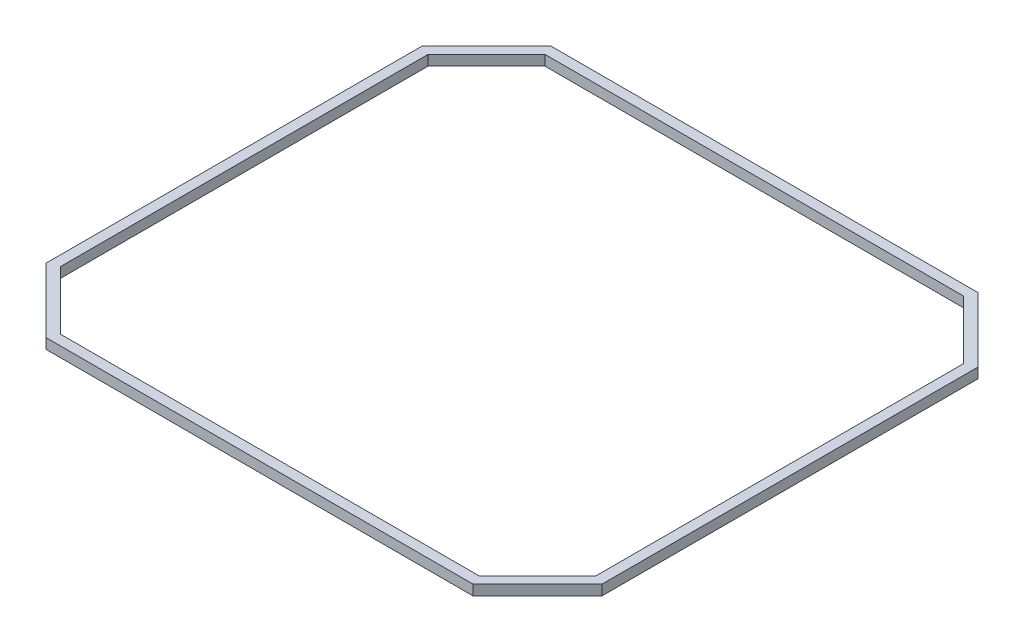
ISO-10303-21;
HEADER;
FILE_DESCRIPTION(('STEP AP214'),'2;1');
FILE_NAME('part.step','',(''),(''),'','','');
FILE_SCHEMA(('AUTOMOTIVE_DESIGN { 1 0 10303 214 1 1 1 1 }'));
ENDSEC;
DATA;
#1=APPLICATION_CONTEXT('core data for automotive mechanical design processes');
#2=APPLICATION_PROTOCOL_DEFINITION('international standard','automotive_design',2000,#1);
#3=PRODUCT_CONTEXT('',#1,'mechanical');
#4=PRODUCT('Part','Part','',(#3));
#5=PRODUCT_RELATED_PRODUCT_CATEGORY('part','',(#4));
#6=PRODUCT_DEFINITION_FORMATION('','',#4);
#7=PRODUCT_DEFINITION_CONTEXT('part definition',#1,'design');
#8=PRODUCT_DEFINITION('design','',#6,#7);
#9=PRODUCT_DEFINITION_SHAPE('','',#8);
#10=(LENGTH_UNIT() NAMED_UNIT(*) SI_UNIT(.MILLI.,.METRE.));
#11=(NAMED_UNIT(*) PLANE_ANGLE_UNIT() SI_UNIT($,.RADIAN.));
#12=(NAMED_UNIT(*) SI_UNIT($,.STERADIAN.) SOLID_ANGLE_UNIT());
#13=UNCERTAINTY_MEASURE_WITH_UNIT(LENGTH_MEASURE(1.E-05),#10,'distance_accuracy_value','');
#14=(GEOMETRIC_REPRESENTATION_CONTEXT(3) GLOBAL_UNCERTAINTY_ASSIGNED_CONTEXT((#13)) GLOBAL_UNIT_ASSIGNED_CONTEXT((#10,
#11,#12)) REPRESENTATION_CONTEXT('',''));
#15=CARTESIAN_POINT('',(0.,0.,0.));
#16=DIRECTION('',(0.,0.,1.));
#17=DIRECTION('',(1.,0.,0.));
#18=AXIS2_PLACEMENT_3D('',#15,#16,#17);
#19=CARTESIAN_POINT('',(0.,2.,0.));
#20=DIRECTION('',(0.,1.,0.));
#21=DIRECTION('',(0.,0.,1.));
#22=AXIS2_PLACEMENT_3D('',#19,#20,#21);
#23=PLANE('',#22);
#24=DIRECTION('',(-1.,0.,0.));
#25=VECTOR('',#24,1.);
#26=CARTESIAN_POINT('',(41.8639610306789,2.,-49.5));
#27=LINE('',#26,#25);
#28=CARTESIAN_POINT('',(41.8639610306789,2.,-49.5));
#29=VERTEX_POINT('',#28);
#30=CARTESIAN_POINT('',(-41.8639610306789,2.,-49.5));
#31=VERTEX_POINT('',#30);
#32=EDGE_CURVE('E211',#29,#31,#27,.T.);
#33=ORIENTED_EDGE('',*,*,#32,.T.);
#34=DIRECTION('',(-0.707106781186547,0.,0.707106781186547));
#35=VECTOR('',#34,1.);
#36=CARTESIAN_POINT('',(-41.8639610306789,2.,-49.5));
#37=LINE('',#36,#35);
#38=CARTESIAN_POINT('',(-54.5,2.,-36.8639610306789));
#39=VERTEX_POINT('',#38);
#40=EDGE_CURVE('E214',#31,#39,#37,.T.);
#41=ORIENTED_EDGE('',*,*,#40,.T.);
#42=DIRECTION('',(0.,0.,1.));
#43=VECTOR('',#42,1.);
#44=CARTESIAN_POINT('',(-54.5,2.,-36.8639610306789));
#45=LINE('',#44,#43);
#46=CARTESIAN_POINT('',(-54.5,2.,36.8639610306789));
#47=VERTEX_POINT('',#46);
#48=EDGE_CURVE('E217',#39,#47,#45,.T.);
#49=ORIENTED_EDGE('',*,*,#48,.T.);
#50=DIRECTION('',(0.707106781186547,0.,0.707106781186547));
#51=VECTOR('',#50,1.);
#52=CARTESIAN_POINT('',(-54.5,2.,36.8639610306789));
#53=LINE('',#52,#51);
#54=CARTESIAN_POINT('',(-41.8639610306789,2.,49.5));
#55=VERTEX_POINT('',#54);
#56=EDGE_CURVE('E219',#47,#55,#53,.T.);
#57=ORIENTED_EDGE('',*,*,#56,.T.);
#58=DIRECTION('',(1.,0.,0.));
#59=VECTOR('',#58,1.);
#60=CARTESIAN_POINT('',(-41.8639610306789,2.,49.5));
#61=LINE('',#60,#59);
#62=CARTESIAN_POINT('',(41.8639610306789,2.,49.5));
#63=VERTEX_POINT('',#62);
#64=EDGE_CURVE('E221',#55,#63,#61,.T.);
#65=ORIENTED_EDGE('',*,*,#64,.T.);
#66=DIRECTION('',(0.707106781186547,0.,-0.707106781186547));
#67=VECTOR('',#66,1.);
#68=CARTESIAN_POINT('',(41.8639610306789,2.,49.5));
#69=LINE('',#68,#67);
#70=CARTESIAN_POINT('',(54.5,2.,36.8639610306789));
#71=VERTEX_POINT('',#70);
#72=EDGE_CURVE('E223',#63,#71,#69,.T.);
#73=ORIENTED_EDGE('',*,*,#72,.T.);
#74=DIRECTION('',(0.,0.,-1.));
#75=VECTOR('',#74,1.);
#76=CARTESIAN_POINT('',(54.5,2.,36.8639610306789));
#77=LINE('',#76,#75);
#78=CARTESIAN_POINT('',(54.5,2.,-36.8639610306789));
#79=VERTEX_POINT('',#78);
#80=EDGE_CURVE('E225',#71,#79,#77,.T.);
#81=ORIENTED_EDGE('',*,*,#80,.T.);
#82=DIRECTION('',(-0.707106781186547,0.,-0.707106781186547));
#83=VECTOR('',#82,1.);
#84=CARTESIAN_POINT('',(54.5,2.,-36.8639610306789));
#85=LINE('',#84,#83);
#86=EDGE_CURVE('E227',#79,#29,#85,.T.);
#87=ORIENTED_EDGE('',*,*,#86,.T.);
#88=EDGE_LOOP('',(#33,#41,#49,#57,#65,#73,#81,#87));
#89=FACE_BOUND('',#88,.T.);
#90=DIRECTION('',(-0.707106781186548,0.,0.707106781186548));
#91=VECTOR('',#90,1.);
#92=CARTESIAN_POINT('',(-41.0355339059327,2.,-47.5));
#93=LINE('',#92,#91);
#94=CARTESIAN_POINT('',(-41.0355339059327,2.,-47.5));
#95=VERTEX_POINT('',#94);
#96=CARTESIAN_POINT('',(-52.5,2.,-36.0355339059327));
#97=VERTEX_POINT('',#96);
#98=EDGE_CURVE('E154',#95,#97,#93,.T.);
#99=ORIENTED_EDGE('',*,*,#98,.F.);
#100=DIRECTION('',(-1.,0.,0.));
#101=VECTOR('',#100,1.);
#102=CARTESIAN_POINT('',(41.0355339059327,2.,-47.5));
#103=LINE('',#102,#101);
#104=CARTESIAN_POINT('',(41.0355339059327,2.,-47.5));
#105=VERTEX_POINT('',#104);
#106=EDGE_CURVE('E146',#105,#95,#103,.T.);
#107=ORIENTED_EDGE('',*,*,#106,.F.);
#108=DIRECTION('',(-0.707106781186548,0.,-0.707106781186548));
#109=VECTOR('',#108,1.);
#110=CARTESIAN_POINT('',(52.5,2.,-36.0355339059327));
#111=LINE('',#110,#109);
#112=CARTESIAN_POINT('',(52.5,2.,-36.0355339059327));
#113=VERTEX_POINT('',#112);
#114=EDGE_CURVE('E179',#113,#105,#111,.T.);
#115=ORIENTED_EDGE('',*,*,#114,.F.);
#116=DIRECTION('',(0.,0.,-1.));
#117=VECTOR('',#116,1.);
#118=CARTESIAN_POINT('',(52.5,2.,36.0355339059327));
#119=LINE('',#118,#117);
#120=CARTESIAN_POINT('',(52.5,2.,36.0355339059327));
#121=VERTEX_POINT('',#120);
#122=EDGE_CURVE('E177',#121,#113,#119,.T.);
#123=ORIENTED_EDGE('',*,*,#122,.F.);
#124=DIRECTION('',(0.707106781186548,0.,-0.707106781186548));
#125=VECTOR('',#124,1.);
#126=CARTESIAN_POINT('',(41.0355339059327,2.,47.5));
#127=LINE('',#126,#125);
#128=CARTESIAN_POINT('',(41.0355339059327,2.,47.5));
#129=VERTEX_POINT('',#128);
#130=EDGE_CURVE('E175',#129,#121,#127,.T.);
#131=ORIENTED_EDGE('',*,*,#130,.F.);
#132=DIRECTION('',(1.,0.,0.));
#133=VECTOR('',#132,1.);
#134=CARTESIAN_POINT('',(-41.0355339059327,2.,47.5));
#135=LINE('',#134,#133);
#136=CARTESIAN_POINT('',(-41.0355339059327,2.,47.5));
#137=VERTEX_POINT('',#136);
#138=EDGE_CURVE('E173',#137,#129,#135,.T.);
#139=ORIENTED_EDGE('',*,*,#138,.F.);
#140=DIRECTION('',(0.707106781186548,0.,0.707106781186548));
#141=VECTOR('',#140,1.);
#142=CARTESIAN_POINT('',(-52.5,2.,36.0355339059327));
#143=LINE('',#142,#141);
#144=CARTESIAN_POINT('',(-52.5,2.,36.0355339059327));
#145=VERTEX_POINT('',#144);
#146=EDGE_CURVE('E169',#145,#137,#143,.T.);
#147=ORIENTED_EDGE('',*,*,#146,.F.);
#148=DIRECTION('',(0.,0.,1.));
#149=VECTOR('',#148,1.);
#150=CARTESIAN_POINT('',(-52.5,2.,-36.0355339059327));
#151=LINE('',#150,#149);
#152=EDGE_CURVE('E167',#97,#145,#151,.T.);
#153=ORIENTED_EDGE('',*,*,#152,.F.);
#154=EDGE_LOOP('',(#99,#107,#115,#123,#131,#139,#147,#153));
#155=FACE_BOUND('',#154,.T.);
#156=ADVANCED_FACE('F33',(#89,#155),#23,.T.);
#157=CARTESIAN_POINT('',(0.,0.,0.));
#158=DIRECTION('',(0.,1.,0.));
#159=DIRECTION('',(0.,0.,1.));
#160=AXIS2_PLACEMENT_3D('',#157,#158,#159);
#161=PLANE('',#160);
#162=DIRECTION('',(-1.,0.,0.));
#163=VECTOR('',#162,1.);
#164=CARTESIAN_POINT('',(41.8639610306789,0.,-49.5));
#165=LINE('',#164,#163);
#166=CARTESIAN_POINT('',(41.8639610306789,0.,-49.5));
#167=VERTEX_POINT('',#166);
#168=CARTESIAN_POINT('',(-41.8639610306789,0.,-49.5));
#169=VERTEX_POINT('',#168);
#170=EDGE_CURVE('E162',#167,#169,#165,.T.);
#171=ORIENTED_EDGE('',*,*,#170,.F.);
#172=DIRECTION('',(-0.707106781186547,0.,-0.707106781186547));
#173=VECTOR('',#172,1.);
#174=CARTESIAN_POINT('',(54.5,0.,-36.8639610306789));
#175=LINE('',#174,#173);
#176=CARTESIAN_POINT('',(54.5,0.,-36.8639610306789));
#177=VERTEX_POINT('',#176);
#178=EDGE_CURVE('E215',#177,#167,#175,.T.);
#179=ORIENTED_EDGE('',*,*,#178,.F.);
#180=DIRECTION('',(0.,0.,-1.));
#181=VECTOR('',#180,1.);
#182=CARTESIAN_POINT('',(54.5,0.,36.8639610306789));
#183=LINE('',#182,#181);
#184=CARTESIAN_POINT('',(54.5,0.,36.8639610306789));
#185=VERTEX_POINT('',#184);
#186=EDGE_CURVE('E242',#185,#177,#183,.T.);
#187=ORIENTED_EDGE('',*,*,#186,.F.);
#188=DIRECTION('',(0.707106781186547,0.,-0.707106781186547));
#189=VECTOR('',#188,1.);
#190=CARTESIAN_POINT('',(41.8639610306789,0.,49.5));
#191=LINE('',#190,#189);
#192=CARTESIAN_POINT('',(41.8639610306789,0.,49.5));
#193=VERTEX_POINT('',#192);
#194=EDGE_CURVE('E240',#193,#185,#191,.T.);
#195=ORIENTED_EDGE('',*,*,#194,.F.);
#196=DIRECTION('',(1.,0.,0.));
#197=VECTOR('',#196,1.);
#198=CARTESIAN_POINT('',(-41.8639610306789,0.,49.5));
#199=LINE('',#198,#197);
#200=CARTESIAN_POINT('',(-41.8639610306789,0.,49.5));
#201=VERTEX_POINT('',#200);
#202=EDGE_CURVE('E238',#201,#193,#199,.T.);
#203=ORIENTED_EDGE('',*,*,#202,.F.);
#204=DIRECTION('',(0.707106781186547,0.,0.707106781186547));
#205=VECTOR('',#204,1.);
#206=CARTESIAN_POINT('',(-54.5,0.,36.8639610306789));
#207=LINE('',#206,#205);
#208=CARTESIAN_POINT('',(-54.5,0.,36.8639610306789));
#209=VERTEX_POINT('',#208);
#210=EDGE_CURVE('E236',#209,#201,#207,.T.);
#211=ORIENTED_EDGE('',*,*,#210,.F.);
#212=DIRECTION('',(0.,0.,1.));
#213=VECTOR('',#212,1.);
#214=CARTESIAN_POINT('',(-54.5,0.,-36.8639610306789));
#215=LINE('',#214,#213);
#216=CARTESIAN_POINT('',(-54.5,0.,-36.8639610306789));
#217=VERTEX_POINT('',#216);
#218=EDGE_CURVE('E234',#217,#209,#215,.T.);
#219=ORIENTED_EDGE('',*,*,#218,.F.);
#220=DIRECTION('',(-0.707106781186547,0.,0.707106781186547));
#221=VECTOR('',#220,1.);
#222=CARTESIAN_POINT('',(-41.8639610306789,0.,-49.5));
#223=LINE('',#222,#221);
#224=EDGE_CURVE('E232',#169,#217,#223,.T.);
#225=ORIENTED_EDGE('',*,*,#224,.F.);
#226=EDGE_LOOP('',(#171,#179,#187,#195,#203,#211,#219,#225));
#227=FACE_BOUND('',#226,.T.);
#228=DIRECTION('',(-1.,0.,0.));
#229=VECTOR('',#228,1.);
#230=CARTESIAN_POINT('',(41.0355339059327,0.,-47.5));
#231=LINE('',#230,#229);
#232=CARTESIAN_POINT('',(41.0355339059328,0.,-47.5));
#233=VERTEX_POINT('',#232);
#234=CARTESIAN_POINT('',(-41.0355339059327,0.,-47.5));
#235=VERTEX_POINT('',#234);
#236=EDGE_CURVE('E56',#233,#235,#231,.T.);
#237=ORIENTED_EDGE('',*,*,#236,.T.);
#238=DIRECTION('',(-0.707106781186548,0.,0.707106781186548));
#239=VECTOR('',#238,1.);
#240=CARTESIAN_POINT('',(-41.0355339059327,0.,-47.5));
#241=LINE('',#240,#239);
#242=CARTESIAN_POINT('',(-52.5,0.,-36.0355339059327));
#243=VERTEX_POINT('',#242);
#244=EDGE_CURVE('E161',#235,#243,#241,.T.);
#245=ORIENTED_EDGE('',*,*,#244,.T.);
#246=DIRECTION('',(0.,0.,1.));
#247=VECTOR('',#246,1.);
#248=CARTESIAN_POINT('',(-52.5,0.,-36.0355339059327));
#249=LINE('',#248,#247);
#250=CARTESIAN_POINT('',(-52.5,0.,36.0355339059327));
#251=VERTEX_POINT('',#250);
#252=EDGE_CURVE('E183',#243,#251,#249,.T.);
#253=ORIENTED_EDGE('',*,*,#252,.T.);
#254=DIRECTION('',(0.707106781186548,0.,0.707106781186548));
#255=VECTOR('',#254,1.);
#256=CARTESIAN_POINT('',(-52.5,0.,36.0355339059327));
#257=LINE('',#256,#255);
#258=CARTESIAN_POINT('',(-41.0355339059327,0.,47.5));
#259=VERTEX_POINT('',#258);
#260=EDGE_CURVE('E186',#251,#259,#257,.T.);
#261=ORIENTED_EDGE('',*,*,#260,.T.);
#262=DIRECTION('',(1.,0.,0.));
#263=VECTOR('',#262,1.);
#264=CARTESIAN_POINT('',(-41.0355339059327,0.,47.5));
#265=LINE('',#264,#263);
#266=CARTESIAN_POINT('',(41.0355339059327,0.,47.5));
#267=VERTEX_POINT('',#266);
#268=EDGE_CURVE('E189',#259,#267,#265,.T.);
#269=ORIENTED_EDGE('',*,*,#268,.T.);
#270=DIRECTION('',(0.707106781186548,0.,-0.707106781186548));
#271=VECTOR('',#270,1.);
#272=CARTESIAN_POINT('',(41.0355339059327,0.,47.5));
#273=LINE('',#272,#271);
#274=CARTESIAN_POINT('',(52.5,0.,36.0355339059327));
#275=VERTEX_POINT('',#274);
#276=EDGE_CURVE('E192',#267,#275,#273,.T.);
#277=ORIENTED_EDGE('',*,*,#276,.T.);
#278=DIRECTION('',(0.,0.,-1.));
#279=VECTOR('',#278,1.);
#280=CARTESIAN_POINT('',(52.5,0.,36.0355339059327));
#281=LINE('',#280,#279);
#282=CARTESIAN_POINT('',(52.5,0.,-36.0355339059327));
#283=VERTEX_POINT('',#282);
#284=EDGE_CURVE('E195',#275,#283,#281,.T.);
#285=ORIENTED_EDGE('',*,*,#284,.T.);
#286=DIRECTION('',(-0.707106781186548,0.,-0.707106781186548));
#287=VECTOR('',#286,1.);
#288=CARTESIAN_POINT('',(52.5,0.,-36.0355339059327));
#289=LINE('',#288,#287);
#290=EDGE_CURVE('E155',#283,#233,#289,.T.);
#291=ORIENTED_EDGE('',*,*,#290,.T.);
#292=EDGE_LOOP('',(#237,#245,#253,#261,#269,#277,#285,#291));
#293=FACE_BOUND('',#292,.T.);
#294=ADVANCED_FACE('F272',(#227,#293),#161,.F.);
#295=CARTESIAN_POINT('',(41.8639610306789,2.,-49.5));
#296=DIRECTION('',(0.,0.,1.));
#297=DIRECTION('',(1.,0.,0.));
#298=AXIS2_PLACEMENT_3D('',#295,#296,#297);
#299=PLANE('',#298);
#300=ORIENTED_EDGE('',*,*,#170,.T.);
#301=DIRECTION('',(0.,-1.,0.));
#302=VECTOR('',#301,1.);
#303=CARTESIAN_POINT('',(-41.8639610306789,2.,-49.5));
#304=LINE('',#303,#302);
#305=EDGE_CURVE('E11',#31,#169,#304,.T.);
#306=ORIENTED_EDGE('',*,*,#305,.F.);
#307=ORIENTED_EDGE('',*,*,#32,.F.);
#308=DIRECTION('',(0.,-1.,0.));
#309=VECTOR('',#308,1.);
#310=CARTESIAN_POINT('',(41.8639610306789,2.,-49.5));
#311=LINE('',#310,#309);
#312=EDGE_CURVE('E229',#29,#167,#311,.T.);
#313=ORIENTED_EDGE('',*,*,#312,.T.);
#314=EDGE_LOOP('',(#300,#306,#307,#313));
#315=FACE_BOUND('',#314,.T.);
#316=ADVANCED_FACE('F35',(#315),#299,.F.);
#317=CARTESIAN_POINT('',(-41.8639610306789,2.,-49.5));
#318=DIRECTION('',(0.707106781186547,0.,0.707106781186547));
#319=DIRECTION('',(0.707106781186548,0.,-0.707106781186548));
#320=AXIS2_PLACEMENT_3D('',#317,#318,#319);
#321=PLANE('',#320);
#322=ORIENTED_EDGE('',*,*,#224,.T.);
#323=DIRECTION('',(0.,-1.,0.));
#324=VECTOR('',#323,1.);
#325=CARTESIAN_POINT('',(-54.5,2.,-36.8639610306789));
#326=LINE('',#325,#324);
#327=EDGE_CURVE('E41',#39,#217,#326,.T.);
#328=ORIENTED_EDGE('',*,*,#327,.F.);
#329=ORIENTED_EDGE('',*,*,#40,.F.);
#330=ORIENTED_EDGE('',*,*,#305,.T.);
#331=EDGE_LOOP('',(#322,#328,#329,#330));
#332=FACE_BOUND('',#331,.T.);
#333=ADVANCED_FACE('F289',(#332),#321,.F.);
#334=CARTESIAN_POINT('',(-54.5,2.,-36.8639610306789));
#335=DIRECTION('',(1.,0.,0.));
#336=DIRECTION('',(0.,0.,-1.));
#337=AXIS2_PLACEMENT_3D('',#334,#335,#336);
#338=PLANE('',#337);
#339=ORIENTED_EDGE('',*,*,#218,.T.);
#340=DIRECTION('',(0.,-1.,0.));
#341=VECTOR('',#340,1.);
#342=CARTESIAN_POINT('',(-54.5,2.,36.8639610306789));
#343=LINE('',#342,#341);
#344=EDGE_CURVE('E259',#47,#209,#343,.T.);
#345=ORIENTED_EDGE('',*,*,#344,.F.);
#346=ORIENTED_EDGE('',*,*,#48,.F.);
#347=ORIENTED_EDGE('',*,*,#327,.T.);
#348=EDGE_LOOP('',(#339,#345,#346,#347));
#349=FACE_BOUND('',#348,.T.);
#350=ADVANCED_FACE('F266',(#349),#338,.F.);
#351=CARTESIAN_POINT('',(-54.5,2.,36.8639610306789));
#352=DIRECTION('',(0.707106781186547,0.,-0.707106781186547));
#353=DIRECTION('',(-0.707106781186548,0.,-0.707106781186548));
#354=AXIS2_PLACEMENT_3D('',#351,#352,#353);
#355=PLANE('',#354);
#356=ORIENTED_EDGE('',*,*,#210,.T.);
#357=DIRECTION('',(0.,-1.,0.));
#358=VECTOR('',#357,1.);
#359=CARTESIAN_POINT('',(-41.8639610306789,2.,49.5));
#360=LINE('',#359,#358);
#361=EDGE_CURVE('E256',#55,#201,#360,.T.);
#362=ORIENTED_EDGE('',*,*,#361,.F.);
#363=ORIENTED_EDGE('',*,*,#56,.F.);
#364=ORIENTED_EDGE('',*,*,#344,.T.);
#365=EDGE_LOOP('',(#356,#362,#363,#364));
#366=FACE_BOUND('',#365,.T.);
#367=ADVANCED_FACE('F278',(#366),#355,.F.);
#368=CARTESIAN_POINT('',(-41.8639610306789,2.,49.5));
#369=DIRECTION('',(0.,0.,-1.));
#370=DIRECTION('',(-1.,0.,0.));
#371=AXIS2_PLACEMENT_3D('',#368,#369,#370);
#372=PLANE('',#371);
#373=ORIENTED_EDGE('',*,*,#202,.T.);
#374=DIRECTION('',(0.,-1.,0.));
#375=VECTOR('',#374,1.);
#376=CARTESIAN_POINT('',(41.8639610306789,2.,49.5));
#377=LINE('',#376,#375);
#378=EDGE_CURVE('E253',#63,#193,#377,.T.);
#379=ORIENTED_EDGE('',*,*,#378,.F.);
#380=ORIENTED_EDGE('',*,*,#64,.F.);
#381=ORIENTED_EDGE('',*,*,#361,.T.);
#382=EDGE_LOOP('',(#373,#379,#380,#381));
#383=FACE_BOUND('',#382,.T.);
#384=ADVANCED_FACE('F282',(#383),#372,.F.);
#385=CARTESIAN_POINT('',(41.8639610306789,2.,49.5));
#386=DIRECTION('',(-0.707106781186547,0.,-0.707106781186547));
#387=DIRECTION('',(-0.707106781186548,0.,0.707106781186548));
#388=AXIS2_PLACEMENT_3D('',#385,#386,#387);
#389=PLANE('',#388);
#390=ORIENTED_EDGE('',*,*,#194,.T.);
#391=DIRECTION('',(0.,-1.,0.));
#392=VECTOR('',#391,1.);
#393=CARTESIAN_POINT('',(54.5,2.,36.8639610306789));
#394=LINE('',#393,#392);
#395=EDGE_CURVE('E250',#71,#185,#394,.T.);
#396=ORIENTED_EDGE('',*,*,#395,.F.);
#397=ORIENTED_EDGE('',*,*,#72,.F.);
#398=ORIENTED_EDGE('',*,*,#378,.T.);
#399=EDGE_LOOP('',(#390,#396,#397,#398));
#400=FACE_BOUND('',#399,.T.);
#401=ADVANCED_FACE('F302',(#400),#389,.F.);
#402=CARTESIAN_POINT('',(54.5,2.,36.8639610306789));
#403=DIRECTION('',(-1.,0.,0.));
#404=DIRECTION('',(0.,0.,1.));
#405=AXIS2_PLACEMENT_3D('',#402,#403,#404);
#406=PLANE('',#405);
#407=ORIENTED_EDGE('',*,*,#186,.T.);
#408=DIRECTION('',(0.,-1.,0.));
#409=VECTOR('',#408,1.);
#410=CARTESIAN_POINT('',(54.5,2.,-36.8639610306789));
#411=LINE('',#410,#409);
#412=EDGE_CURVE('E247',#79,#177,#411,.T.);
#413=ORIENTED_EDGE('',*,*,#412,.F.);
#414=ORIENTED_EDGE('',*,*,#80,.F.);
#415=ORIENTED_EDGE('',*,*,#395,.T.);
#416=EDGE_LOOP('',(#407,#413,#414,#415));
#417=FACE_BOUND('',#416,.T.);
#418=ADVANCED_FACE('F300',(#417),#406,.F.);
#419=CARTESIAN_POINT('',(54.5,2.,-36.8639610306789));
#420=DIRECTION('',(-0.707106781186547,0.,0.707106781186547));
#421=DIRECTION('',(0.707106781186548,0.,0.707106781186548));
#422=AXIS2_PLACEMENT_3D('',#419,#420,#421);
#423=PLANE('',#422);
#424=ORIENTED_EDGE('',*,*,#178,.T.);
#425=ORIENTED_EDGE('',*,*,#312,.F.);
#426=ORIENTED_EDGE('',*,*,#86,.F.);
#427=ORIENTED_EDGE('',*,*,#412,.T.);
#428=EDGE_LOOP('',(#424,#425,#426,#427));
#429=FACE_BOUND('',#428,.T.);
#430=ADVANCED_FACE('F295',(#429),#423,.F.);
#431=CARTESIAN_POINT('',(41.0355339059327,2.,-47.5));
#432=DIRECTION('',(0.,0.,1.));
#433=DIRECTION('',(1.,0.,0.));
#434=AXIS2_PLACEMENT_3D('',#431,#432,#433);
#435=PLANE('',#434);
#436=ORIENTED_EDGE('',*,*,#236,.F.);
#437=DIRECTION('',(0.,-1.,0.));
#438=VECTOR('',#437,1.);
#439=CARTESIAN_POINT('',(41.0355339059327,2.,-47.5));
#440=LINE('',#439,#438);
#441=EDGE_CURVE('E150',#105,#233,#440,.T.);
#442=ORIENTED_EDGE('',*,*,#441,.F.);
#443=ORIENTED_EDGE('',*,*,#106,.T.);
#444=DIRECTION('',(0.,-1.,0.));
#445=VECTOR('',#444,1.);
#446=CARTESIAN_POINT('',(-41.0355339059327,2.,-47.5));
#447=LINE('',#446,#445);
#448=EDGE_CURVE('E149',#95,#235,#447,.T.);
#449=ORIENTED_EDGE('',*,*,#448,.T.);
#450=EDGE_LOOP('',(#436,#442,#443,#449));
#451=FACE_BOUND('',#450,.T.);
#452=ADVANCED_FACE('F148',(#451),#435,.T.);
#453=CARTESIAN_POINT('',(-41.0355339059327,2.,-47.5));
#454=DIRECTION('',(0.707106781186547,0.,0.707106781186547));
#455=DIRECTION('',(0.707106781186548,0.,-0.707106781186548));
#456=AXIS2_PLACEMENT_3D('',#453,#454,#455);
#457=PLANE('',#456);
#458=ORIENTED_EDGE('',*,*,#244,.F.);
#459=ORIENTED_EDGE('',*,*,#448,.F.);
#460=ORIENTED_EDGE('',*,*,#98,.T.);
#461=DIRECTION('',(0.,-1.,0.));
#462=VECTOR('',#461,1.);
#463=CARTESIAN_POINT('',(-52.5,2.,-36.0355339059327));
#464=LINE('',#463,#462);
#465=EDGE_CURVE('E163',#97,#243,#464,.T.);
#466=ORIENTED_EDGE('',*,*,#465,.T.);
#467=EDGE_LOOP('',(#458,#459,#460,#466));
#468=FACE_BOUND('',#467,.T.);
#469=ADVANCED_FACE('F158',(#468),#457,.T.);
#470=CARTESIAN_POINT('',(-52.5,2.,-36.0355339059327));
#471=DIRECTION('',(1.,0.,0.));
#472=DIRECTION('',(0.,0.,-1.));
#473=AXIS2_PLACEMENT_3D('',#470,#471,#472);
#474=PLANE('',#473);
#475=ORIENTED_EDGE('',*,*,#252,.F.);
#476=ORIENTED_EDGE('',*,*,#465,.F.);
#477=ORIENTED_EDGE('',*,*,#152,.T.);
#478=DIRECTION('',(0.,-1.,0.));
#479=VECTOR('',#478,1.);
#480=CARTESIAN_POINT('',(-52.5,2.,36.0355339059327));
#481=LINE('',#480,#479);
#482=EDGE_CURVE('E208',#145,#251,#481,.T.);
#483=ORIENTED_EDGE('',*,*,#482,.T.);
#484=EDGE_LOOP('',(#475,#476,#477,#483));
#485=FACE_BOUND('',#484,.T.);
#486=ADVANCED_FACE('F327',(#485),#474,.T.);
#487=CARTESIAN_POINT('',(-52.5,2.,36.0355339059327));
#488=DIRECTION('',(0.707106781186547,0.,-0.707106781186547));
#489=DIRECTION('',(-0.707106781186548,0.,-0.707106781186548));
#490=AXIS2_PLACEMENT_3D('',#487,#488,#489);
#491=PLANE('',#490);
#492=ORIENTED_EDGE('',*,*,#260,.F.);
#493=ORIENTED_EDGE('',*,*,#482,.F.);
#494=ORIENTED_EDGE('',*,*,#146,.T.);
#495=DIRECTION('',(0.,-1.,0.));
#496=VECTOR('',#495,1.);
#497=CARTESIAN_POINT('',(-41.0355339059327,2.,47.5));
#498=LINE('',#497,#496);
#499=EDGE_CURVE('E206',#137,#259,#498,.T.);
#500=ORIENTED_EDGE('',*,*,#499,.T.);
#501=EDGE_LOOP('',(#492,#493,#494,#500));
#502=FACE_BOUND('',#501,.T.);
#503=ADVANCED_FACE('F331',(#502),#491,.T.);
#504=CARTESIAN_POINT('',(-41.0355339059327,2.,47.5));
#505=DIRECTION('',(0.,0.,-1.));
#506=DIRECTION('',(-1.,0.,0.));
#507=AXIS2_PLACEMENT_3D('',#504,#505,#506);
#508=PLANE('',#507);
#509=ORIENTED_EDGE('',*,*,#268,.F.);
#510=ORIENTED_EDGE('',*,*,#499,.F.);
#511=ORIENTED_EDGE('',*,*,#138,.T.);
#512=DIRECTION('',(0.,-1.,0.));
#513=VECTOR('',#512,1.);
#514=CARTESIAN_POINT('',(41.0355339059327,2.,47.5));
#515=LINE('',#514,#513);
#516=EDGE_CURVE('E204',#129,#267,#515,.T.);
#517=ORIENTED_EDGE('',*,*,#516,.T.);
#518=EDGE_LOOP('',(#509,#510,#511,#517));
#519=FACE_BOUND('',#518,.T.);
#520=ADVANCED_FACE('F337',(#519),#508,.T.);
#521=CARTESIAN_POINT('',(41.0355339059327,2.,47.5));
#522=DIRECTION('',(-0.707106781186547,0.,-0.707106781186547));
#523=DIRECTION('',(-0.707106781186548,0.,0.707106781186548));
#524=AXIS2_PLACEMENT_3D('',#521,#522,#523);
#525=PLANE('',#524);
#526=ORIENTED_EDGE('',*,*,#276,.F.);
#527=ORIENTED_EDGE('',*,*,#516,.F.);
#528=ORIENTED_EDGE('',*,*,#130,.T.);
#529=DIRECTION('',(0.,-1.,0.));
#530=VECTOR('',#529,1.);
#531=CARTESIAN_POINT('',(52.5,2.,36.0355339059327));
#532=LINE('',#531,#530);
#533=EDGE_CURVE('E202',#121,#275,#532,.T.);
#534=ORIENTED_EDGE('',*,*,#533,.T.);
#535=EDGE_LOOP('',(#526,#527,#528,#534));
#536=FACE_BOUND('',#535,.T.);
#537=ADVANCED_FACE('F341',(#536),#525,.T.);
#538=CARTESIAN_POINT('',(52.5,2.,36.0355339059327));
#539=DIRECTION('',(-1.,0.,0.));
#540=DIRECTION('',(0.,0.,1.));
#541=AXIS2_PLACEMENT_3D('',#538,#539,#540);
#542=PLANE('',#541);
#543=ORIENTED_EDGE('',*,*,#284,.F.);
#544=ORIENTED_EDGE('',*,*,#533,.F.);
#545=ORIENTED_EDGE('',*,*,#122,.T.);
#546=DIRECTION('',(0.,-1.,0.));
#547=VECTOR('',#546,1.);
#548=CARTESIAN_POINT('',(52.5,2.,-36.0355339059327));
#549=LINE('',#548,#547);
#550=EDGE_CURVE('E48',#113,#283,#549,.T.);
#551=ORIENTED_EDGE('',*,*,#550,.T.);
#552=EDGE_LOOP('',(#543,#544,#545,#551));
#553=FACE_BOUND('',#552,.T.);
#554=ADVANCED_FACE('F345',(#553),#542,.T.);
#555=CARTESIAN_POINT('',(52.5,2.,-36.0355339059327));
#556=DIRECTION('',(-0.707106781186547,0.,0.707106781186547));
#557=DIRECTION('',(0.707106781186548,0.,0.707106781186548));
#558=AXIS2_PLACEMENT_3D('',#555,#556,#557);
#559=PLANE('',#558);
#560=ORIENTED_EDGE('',*,*,#290,.F.);
#561=ORIENTED_EDGE('',*,*,#550,.F.);
#562=ORIENTED_EDGE('',*,*,#114,.T.);
#563=ORIENTED_EDGE('',*,*,#441,.T.);
#564=EDGE_LOOP('',(#560,#561,#562,#563));
#565=FACE_BOUND('',#564,.T.);
#566=ADVANCED_FACE('F349',(#565),#559,.T.);
#567=CLOSED_SHELL('',(#156,#294,#316,#333,#350,#367,#384,#401,#418,#430,#452,#469,#486,#503,
#520,#537,#554,#566));
#568=MANIFOLD_SOLID_BREP('B2',#567);
#569=ADVANCED_BREP_SHAPE_REPRESENTATION('',(#18,#568),#14);
#570=SHAPE_DEFINITION_REPRESENTATION(#9,#569);
ENDSEC;
END-ISO-10303-21;
